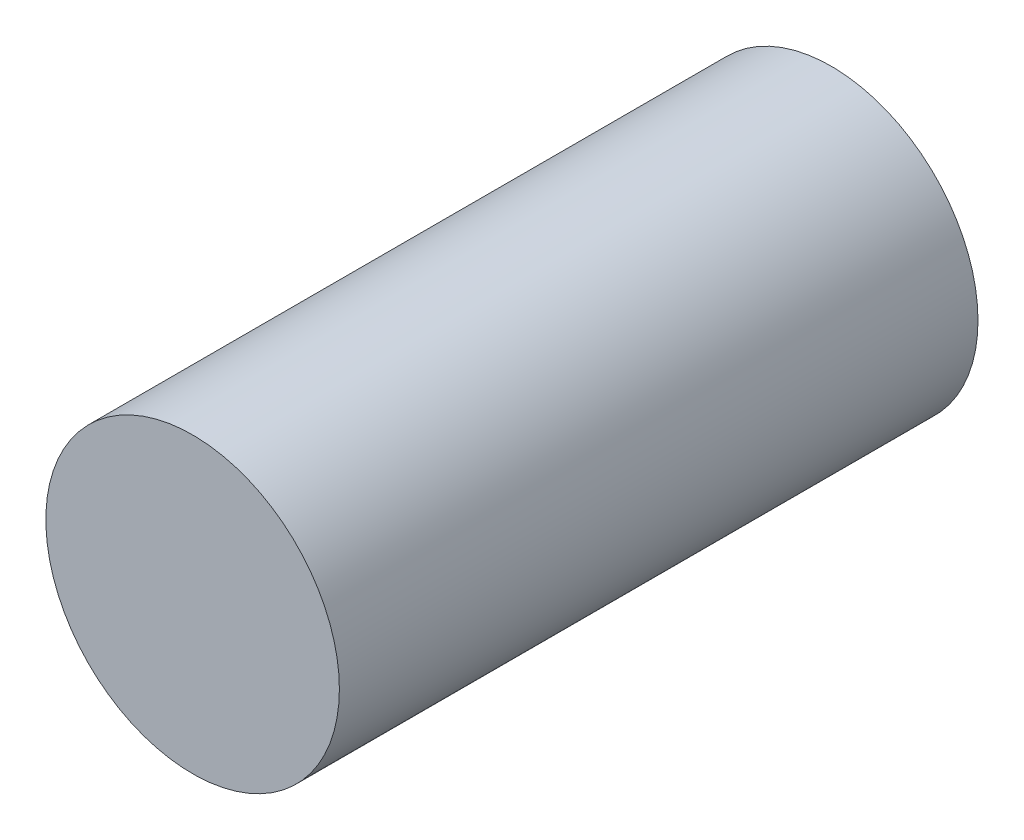
ISO-10303-21;
HEADER;
FILE_DESCRIPTION(('STEP AP214'),'2;1');
FILE_NAME('part.step','',(''),(''),'','','');
FILE_SCHEMA(('AUTOMOTIVE_DESIGN { 1 0 10303 214 1 1 1 1 }'));
ENDSEC;
DATA;
#1=APPLICATION_CONTEXT('core data for automotive mechanical design processes');
#2=APPLICATION_PROTOCOL_DEFINITION('international standard','automotive_design',2000,#1);
#3=PRODUCT_CONTEXT('',#1,'mechanical');
#4=PRODUCT('Part','Part','',(#3));
#5=PRODUCT_RELATED_PRODUCT_CATEGORY('part','',(#4));
#6=PRODUCT_DEFINITION_FORMATION('','',#4);
#7=PRODUCT_DEFINITION_CONTEXT('part definition',#1,'design');
#8=PRODUCT_DEFINITION('design','',#6,#7);
#9=PRODUCT_DEFINITION_SHAPE('','',#8);
#10=(LENGTH_UNIT() NAMED_UNIT(*) SI_UNIT(.MILLI.,.METRE.));
#11=(NAMED_UNIT(*) PLANE_ANGLE_UNIT() SI_UNIT($,.RADIAN.));
#12=(NAMED_UNIT(*) SI_UNIT($,.STERADIAN.) SOLID_ANGLE_UNIT());
#13=UNCERTAINTY_MEASURE_WITH_UNIT(LENGTH_MEASURE(1.E-05),#10,'distance_accuracy_value','');
#14=(GEOMETRIC_REPRESENTATION_CONTEXT(3) GLOBAL_UNCERTAINTY_ASSIGNED_CONTEXT((#13)) GLOBAL_UNIT_ASSIGNED_CONTEXT((#10,
#11,#12)) REPRESENTATION_CONTEXT('',''));
#15=CARTESIAN_POINT('',(0.,0.,0.));
#16=DIRECTION('',(0.,0.,1.));
#17=DIRECTION('',(1.,0.,0.));
#18=AXIS2_PLACEMENT_3D('',#15,#16,#17);
#19=CARTESIAN_POINT('',(0.,0.,493.));
#20=DIRECTION('',(0.,0.,-1.));
#21=DIRECTION('',(-1.,0.,0.));
#22=AXIS2_PLACEMENT_3D('',#19,#20,#21);
#23=CYLINDRICAL_SURFACE('',#22,113.3);
#24=CARTESIAN_POINT('',(0.,0.,493.));
#25=DIRECTION('',(0.,0.,1.));
#26=DIRECTION('',(1.,0.,0.));
#27=AXIS2_PLACEMENT_3D('',#24,#25,#26);
#28=CIRCLE('',#27,113.3);
#29=CARTESIAN_POINT('',(113.3,0.,493.));
#30=VERTEX_POINT('',#29);
#31=EDGE_CURVE('E10',#30,#30,#28,.T.);
#32=ORIENTED_EDGE('',*,*,#31,.F.);
#33=EDGE_LOOP('',(#32));
#34=FACE_BOUND('',#33,.T.);
#35=CARTESIAN_POINT('',(0.,0.,0.));
#36=DIRECTION('',(0.,0.,1.));
#37=DIRECTION('',(1.,0.,0.));
#38=AXIS2_PLACEMENT_3D('',#35,#36,#37);
#39=CIRCLE('',#38,113.3);
#40=CARTESIAN_POINT('',(113.3,0.,0.));
#41=VERTEX_POINT('',#40);
#42=EDGE_CURVE('E33',#41,#41,#39,.T.);
#43=ORIENTED_EDGE('',*,*,#42,.T.);
#44=EDGE_LOOP('',(#43));
#45=FACE_BOUND('',#44,.T.);
#46=ADVANCED_FACE('F30',(#34,#45),#23,.T.);
#47=CARTESIAN_POINT('',(0.,0.,493.));
#48=DIRECTION('',(0.,0.,1.));
#49=DIRECTION('',(1.,0.,0.));
#50=AXIS2_PLACEMENT_3D('',#47,#48,#49);
#51=PLANE('',#50);
#52=ORIENTED_EDGE('',*,*,#31,.T.);
#53=EDGE_LOOP('',(#52));
#54=FACE_BOUND('',#53,.T.);
#55=ADVANCED_FACE('F45',(#54),#51,.T.);
#56=CARTESIAN_POINT('',(0.,0.,0.));
#57=DIRECTION('',(0.,0.,1.));
#58=DIRECTION('',(1.,0.,0.));
#59=AXIS2_PLACEMENT_3D('',#56,#57,#58);
#60=PLANE('',#59);
#61=ORIENTED_EDGE('',*,*,#42,.F.);
#62=EDGE_LOOP('',(#61));
#63=FACE_BOUND('',#62,.T.);
#64=ADVANCED_FACE('F43',(#63),#60,.F.);
#65=CLOSED_SHELL('',(#46,#55,#64));
#66=MANIFOLD_SOLID_BREP('B2',#65);
#67=ADVANCED_BREP_SHAPE_REPRESENTATION('',(#18,#66),#14);
#68=SHAPE_DEFINITION_REPRESENTATION(#9,#67);
ENDSEC;
END-ISO-10303-21;
